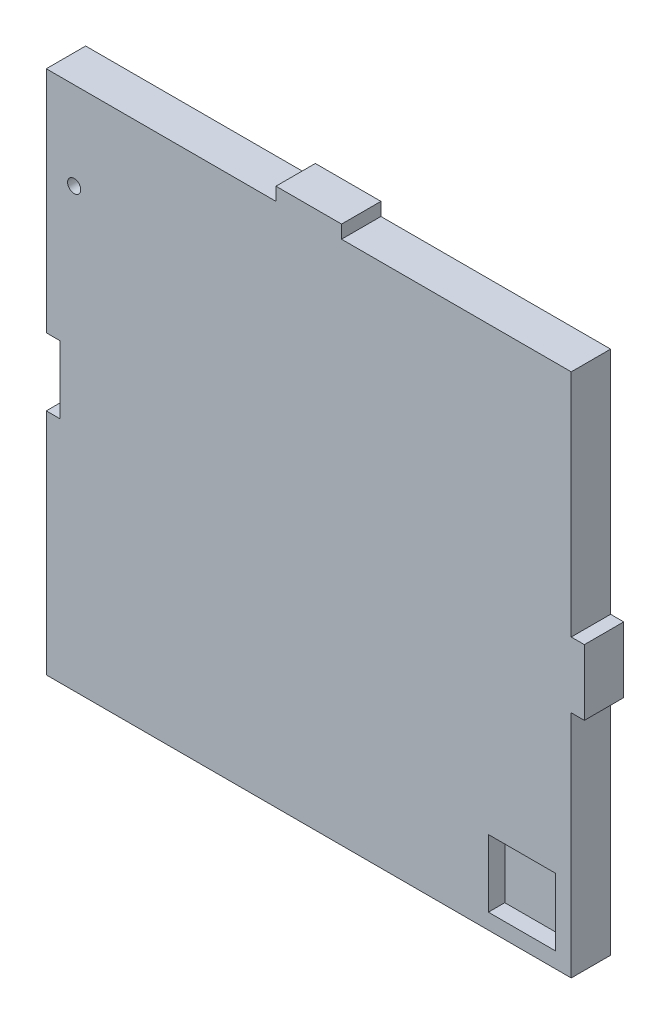
ISO-10303-21;
HEADER;
FILE_DESCRIPTION(('STEP AP214'),'2;1');
FILE_NAME('part.step','',(''),(''),'','','');
FILE_SCHEMA(('AUTOMOTIVE_DESIGN { 1 0 10303 214 1 1 1 1 }'));
ENDSEC;
DATA;
#1=APPLICATION_CONTEXT('core data for automotive mechanical design processes');
#2=APPLICATION_PROTOCOL_DEFINITION('international standard','automotive_design',2000,#1);
#3=PRODUCT_CONTEXT('',#1,'mechanical');
#4=PRODUCT('Part','Part','',(#3));
#5=PRODUCT_RELATED_PRODUCT_CATEGORY('part','',(#4));
#6=PRODUCT_DEFINITION_FORMATION('','',#4);
#7=PRODUCT_DEFINITION_CONTEXT('part definition',#1,'design');
#8=PRODUCT_DEFINITION('design','',#6,#7);
#9=PRODUCT_DEFINITION_SHAPE('','',#8);
#10=(LENGTH_UNIT() NAMED_UNIT(*) SI_UNIT(.MILLI.,.METRE.));
#11=(NAMED_UNIT(*) PLANE_ANGLE_UNIT() SI_UNIT($,.RADIAN.));
#12=(NAMED_UNIT(*) SI_UNIT($,.STERADIAN.) SOLID_ANGLE_UNIT());
#13=UNCERTAINTY_MEASURE_WITH_UNIT(LENGTH_MEASURE(1.E-05),#10,'distance_accuracy_value','');
#14=(GEOMETRIC_REPRESENTATION_CONTEXT(3) GLOBAL_UNCERTAINTY_ASSIGNED_CONTEXT((#13)) GLOBAL_UNIT_ASSIGNED_CONTEXT((#10,
#11,#12)) REPRESENTATION_CONTEXT('',''));
#15=CARTESIAN_POINT('',(0.,0.,0.));
#16=DIRECTION('',(0.,0.,1.));
#17=DIRECTION('',(1.,0.,0.));
#18=AXIS2_PLACEMENT_3D('',#15,#16,#17);
#19=CARTESIAN_POINT('',(8.50000000002549,133.299999999994,12.));
#20=DIRECTION('',(0.,0.,-1.));
#21=DIRECTION('',(-1.,0.,0.));
#22=AXIS2_PLACEMENT_3D('',#19,#20,#21);
#23=CYLINDRICAL_SURFACE('',#22,2.);
#24=CARTESIAN_POINT('',(8.50000000002549,133.299999999994,12.));
#25=DIRECTION('',(0.,0.,1.));
#26=DIRECTION('',(1.,0.,0.));
#27=AXIS2_PLACEMENT_3D('',#24,#25,#26);
#28=CIRCLE('',#27,2.);
#29=CARTESIAN_POINT('',(10.5000000000255,133.299999999994,12.));
#30=VERTEX_POINT('',#29);
#31=EDGE_CURVE('E205',#30,#30,#28,.T.);
#32=ORIENTED_EDGE('',*,*,#31,.T.);
#33=EDGE_LOOP('',(#32));
#34=FACE_BOUND('',#33,.T.);
#35=CARTESIAN_POINT('',(8.50000000002549,133.299999999994,8.));
#36=DIRECTION('',(0.,0.,-1.));
#37=DIRECTION('',(-1.,0.,0.));
#38=AXIS2_PLACEMENT_3D('',#35,#36,#37);
#39=CIRCLE('',#38,2.);
#40=CARTESIAN_POINT('',(6.50000000002548,133.299999999994,8.));
#41=VERTEX_POINT('',#40);
#42=EDGE_CURVE('E43',#41,#41,#39,.T.);
#43=ORIENTED_EDGE('',*,*,#42,.T.);
#44=EDGE_LOOP('',(#43));
#45=FACE_BOUND('',#44,.T.);
#46=ADVANCED_FACE('F39',(#34,#45),#23,.F.);
#47=CARTESIAN_POINT('',(0.,0.,12.));
#48=DIRECTION('',(0.,0.,1.));
#49=DIRECTION('',(1.,0.,0.));
#50=AXIS2_PLACEMENT_3D('',#47,#48,#49);
#51=PLANE('',#50);
#52=DIRECTION('',(0.,-1.,0.));
#53=VECTOR('',#52,1.);
#54=CARTESIAN_POINT('',(134.75,25.25,12.));
#55=LINE('',#54,#53);
#56=CARTESIAN_POINT('',(134.75,25.25,12.));
#57=VERTEX_POINT('',#56);
#58=CARTESIAN_POINT('',(134.75,4.75,12.));
#59=VERTEX_POINT('',#58);
#60=EDGE_CURVE('E54',#57,#59,#55,.T.);
#61=ORIENTED_EDGE('',*,*,#60,.F.);
#62=DIRECTION('',(-1.,0.,0.));
#63=VECTOR('',#62,1.);
#64=CARTESIAN_POINT('',(155.25,25.25,12.));
#65=LINE('',#64,#63);
#66=CARTESIAN_POINT('',(155.25,25.25,12.));
#67=VERTEX_POINT('',#66);
#68=EDGE_CURVE('E333',#67,#57,#65,.T.);
#69=ORIENTED_EDGE('',*,*,#68,.F.);
#70=DIRECTION('',(0.,1.,0.));
#71=VECTOR('',#70,1.);
#72=CARTESIAN_POINT('',(155.25,4.75,12.));
#73=LINE('',#72,#71);
#74=CARTESIAN_POINT('',(155.25,4.75,12.));
#75=VERTEX_POINT('',#74);
#76=EDGE_CURVE('E338',#75,#67,#73,.T.);
#77=ORIENTED_EDGE('',*,*,#76,.F.);
#78=DIRECTION('',(1.,0.,0.));
#79=VECTOR('',#78,1.);
#80=CARTESIAN_POINT('',(134.75,4.75,12.));
#81=LINE('',#80,#79);
#82=EDGE_CURVE('E345',#59,#75,#81,.T.);
#83=ORIENTED_EDGE('',*,*,#82,.F.);
#84=EDGE_LOOP('',(#61,#69,#77,#83));
#85=FACE_BOUND('',#84,.T.);
#86=DIRECTION('',(0.,-1.,0.));
#87=VECTOR('',#86,1.);
#88=CARTESIAN_POINT('',(0.,69.7,12.));
#89=LINE('',#88,#87);
#90=CARTESIAN_POINT('',(0.,69.7,12.));
#91=VERTEX_POINT('',#90);
#92=CARTESIAN_POINT('',(0.,0.,12.));
#93=VERTEX_POINT('',#92);
#94=EDGE_CURVE('E229',#91,#93,#89,.T.);
#95=ORIENTED_EDGE('',*,*,#94,.T.);
#96=DIRECTION('',(1.,0.,0.));
#97=VECTOR('',#96,1.);
#98=CARTESIAN_POINT('',(0.,0.,12.));
#99=LINE('',#98,#97);
#100=CARTESIAN_POINT('',(160.,0.,12.));
#101=VERTEX_POINT('',#100);
#102=EDGE_CURVE('E129',#93,#101,#99,.T.);
#103=ORIENTED_EDGE('',*,*,#102,.T.);
#104=DIRECTION('',(0.,1.,0.));
#105=VECTOR('',#104,1.);
#106=CARTESIAN_POINT('',(160.,0.,12.));
#107=LINE('',#106,#105);
#108=CARTESIAN_POINT('',(160.,70.,12.));
#109=VERTEX_POINT('',#108);
#110=EDGE_CURVE('E269',#101,#109,#107,.T.);
#111=ORIENTED_EDGE('',*,*,#110,.T.);
#112=DIRECTION('',(1.,0.,0.));
#113=VECTOR('',#112,1.);
#114=CARTESIAN_POINT('',(160.,70.,12.));
#115=LINE('',#114,#113);
#116=CARTESIAN_POINT('',(164.,70.,12.));
#117=VERTEX_POINT('',#116);
#118=EDGE_CURVE('E286',#109,#117,#115,.T.);
#119=ORIENTED_EDGE('',*,*,#118,.T.);
#120=DIRECTION('',(0.,1.,0.));
#121=VECTOR('',#120,1.);
#122=CARTESIAN_POINT('',(164.,70.,12.));
#123=LINE('',#122,#121);
#124=CARTESIAN_POINT('',(164.,90.,12.));
#125=VERTEX_POINT('',#124);
#126=EDGE_CURVE('E284',#117,#125,#123,.T.);
#127=ORIENTED_EDGE('',*,*,#126,.T.);
#128=DIRECTION('',(-1.,0.,0.));
#129=VECTOR('',#128,1.);
#130=CARTESIAN_POINT('',(164.,90.,12.));
#131=LINE('',#130,#129);
#132=CARTESIAN_POINT('',(160.,90.,12.));
#133=VERTEX_POINT('',#132);
#134=EDGE_CURVE('E290',#125,#133,#131,.T.);
#135=ORIENTED_EDGE('',*,*,#134,.T.);
#136=DIRECTION('',(0.,1.,0.));
#137=VECTOR('',#136,1.);
#138=CARTESIAN_POINT('',(160.,90.,12.));
#139=LINE('',#138,#137);
#140=CARTESIAN_POINT('',(160.,160.,12.));
#141=VERTEX_POINT('',#140);
#142=EDGE_CURVE('E289',#133,#141,#139,.T.);
#143=ORIENTED_EDGE('',*,*,#142,.T.);
#144=DIRECTION('',(-1.,0.,0.));
#145=VECTOR('',#144,1.);
#146=CARTESIAN_POINT('',(160.,160.,12.));
#147=LINE('',#146,#145);
#148=CARTESIAN_POINT('',(90.,160.,12.));
#149=VERTEX_POINT('',#148);
#150=EDGE_CURVE('E296',#141,#149,#147,.T.);
#151=ORIENTED_EDGE('',*,*,#150,.T.);
#152=DIRECTION('',(0.,1.,0.));
#153=VECTOR('',#152,1.);
#154=CARTESIAN_POINT('',(90.,160.,12.));
#155=LINE('',#154,#153);
#156=CARTESIAN_POINT('',(90.,164.,12.));
#157=VERTEX_POINT('',#156);
#158=EDGE_CURVE('E297',#149,#157,#155,.T.);
#159=ORIENTED_EDGE('',*,*,#158,.T.);
#160=DIRECTION('',(-1.,0.,0.));
#161=VECTOR('',#160,1.);
#162=CARTESIAN_POINT('',(90.,164.,12.));
#163=LINE('',#162,#161);
#164=CARTESIAN_POINT('',(70.,164.,12.));
#165=VERTEX_POINT('',#164);
#166=EDGE_CURVE('E299',#157,#165,#163,.T.);
#167=ORIENTED_EDGE('',*,*,#166,.T.);
#168=DIRECTION('',(0.,-1.,0.));
#169=VECTOR('',#168,1.);
#170=CARTESIAN_POINT('',(70.,164.,12.));
#171=LINE('',#170,#169);
#172=CARTESIAN_POINT('',(70.,160.,12.));
#173=VERTEX_POINT('',#172);
#174=EDGE_CURVE('E305',#165,#173,#171,.T.);
#175=ORIENTED_EDGE('',*,*,#174,.T.);
#176=DIRECTION('',(-1.,0.,0.));
#177=VECTOR('',#176,1.);
#178=CARTESIAN_POINT('',(70.,160.,12.));
#179=LINE('',#178,#177);
#180=CARTESIAN_POINT('',(0.,160.,12.));
#181=VERTEX_POINT('',#180);
#182=EDGE_CURVE('E302',#173,#181,#179,.T.);
#183=ORIENTED_EDGE('',*,*,#182,.T.);
#184=DIRECTION('',(0.,-1.,0.));
#185=VECTOR('',#184,1.);
#186=CARTESIAN_POINT('',(0.,160.,12.));
#187=LINE('',#186,#185);
#188=CARTESIAN_POINT('',(0.,90.3,12.));
#189=VERTEX_POINT('',#188);
#190=EDGE_CURVE('E180',#181,#189,#187,.T.);
#191=ORIENTED_EDGE('',*,*,#190,.T.);
#192=DIRECTION('',(1.,0.,0.));
#193=VECTOR('',#192,1.);
#194=CARTESIAN_POINT('',(0.,90.3,12.));
#195=LINE('',#194,#193);
#196=CARTESIAN_POINT('',(4.2,90.3,12.));
#197=VERTEX_POINT('',#196);
#198=EDGE_CURVE('E166',#189,#197,#195,.T.);
#199=ORIENTED_EDGE('',*,*,#198,.T.);
#200=DIRECTION('',(0.,-1.,0.));
#201=VECTOR('',#200,1.);
#202=CARTESIAN_POINT('',(4.2,90.3,12.));
#203=LINE('',#202,#201);
#204=CARTESIAN_POINT('',(4.2,69.7,12.));
#205=VERTEX_POINT('',#204);
#206=EDGE_CURVE('E173',#197,#205,#203,.T.);
#207=ORIENTED_EDGE('',*,*,#206,.T.);
#208=DIRECTION('',(-1.,0.,0.));
#209=VECTOR('',#208,1.);
#210=CARTESIAN_POINT('',(4.2,69.7,12.));
#211=LINE('',#210,#209);
#212=EDGE_CURVE('E63',#205,#91,#211,.T.);
#213=ORIENTED_EDGE('',*,*,#212,.T.);
#214=EDGE_LOOP('',(#95,#103,#111,#119,#127,#135,#143,#151,#159,#167,#175,#183,#191,#199,#207,#213));
#215=FACE_BOUND('',#214,.T.);
#216=ORIENTED_EDGE('',*,*,#31,.F.);
#217=EDGE_LOOP('',(#216));
#218=FACE_BOUND('',#217,.T.);
#219=ADVANCED_FACE('F171',(#85,#215,#218),#51,.T.);
#220=CARTESIAN_POINT('',(0.,0.,0.));
#221=DIRECTION('',(0.,0.,1.));
#222=DIRECTION('',(1.,0.,0.));
#223=AXIS2_PLACEMENT_3D('',#220,#221,#222);
#224=PLANE('',#223);
#225=CARTESIAN_POINT('',(8.50000000002549,133.299999999994,0.));
#226=DIRECTION('',(0.,0.,-1.));
#227=DIRECTION('',(-1.,0.,0.));
#228=AXIS2_PLACEMENT_3D('',#225,#226,#227);
#229=CIRCLE('',#228,3.45000000000001);
#230=CARTESIAN_POINT('',(5.05000000002548,133.299999999994,0.));
#231=VERTEX_POINT('',#230);
#232=EDGE_CURVE('E358',#231,#231,#229,.T.);
#233=ORIENTED_EDGE('',*,*,#232,.F.);
#234=EDGE_LOOP('',(#233));
#235=FACE_BOUND('',#234,.T.);
#236=DIRECTION('',(0.,-1.,0.));
#237=VECTOR('',#236,1.);
#238=CARTESIAN_POINT('',(0.,69.7,0.));
#239=LINE('',#238,#237);
#240=CARTESIAN_POINT('',(0.,69.7,0.));
#241=VERTEX_POINT('',#240);
#242=CARTESIAN_POINT('',(0.,0.,0.));
#243=VERTEX_POINT('',#242);
#244=EDGE_CURVE('E196',#241,#243,#239,.T.);
#245=ORIENTED_EDGE('',*,*,#244,.F.);
#246=DIRECTION('',(-1.,0.,0.));
#247=VECTOR('',#246,1.);
#248=CARTESIAN_POINT('',(4.2,69.7,0.));
#249=LINE('',#248,#247);
#250=CARTESIAN_POINT('',(4.2,69.7,0.));
#251=VERTEX_POINT('',#250);
#252=EDGE_CURVE('E123',#251,#241,#249,.T.);
#253=ORIENTED_EDGE('',*,*,#252,.F.);
#254=DIRECTION('',(0.,-1.,0.));
#255=VECTOR('',#254,1.);
#256=CARTESIAN_POINT('',(4.2,90.3,0.));
#257=LINE('',#256,#255);
#258=CARTESIAN_POINT('',(4.2,90.3,0.));
#259=VERTEX_POINT('',#258);
#260=EDGE_CURVE('E230',#259,#251,#257,.T.);
#261=ORIENTED_EDGE('',*,*,#260,.F.);
#262=DIRECTION('',(1.,0.,0.));
#263=VECTOR('',#262,1.);
#264=CARTESIAN_POINT('',(0.,90.3,0.));
#265=LINE('',#264,#263);
#266=CARTESIAN_POINT('',(0.,90.3,0.));
#267=VERTEX_POINT('',#266);
#268=EDGE_CURVE('E186',#267,#259,#265,.T.);
#269=ORIENTED_EDGE('',*,*,#268,.F.);
#270=DIRECTION('',(0.,-1.,0.));
#271=VECTOR('',#270,1.);
#272=CARTESIAN_POINT('',(0.,160.,0.));
#273=LINE('',#272,#271);
#274=CARTESIAN_POINT('',(0.,160.,0.));
#275=VERTEX_POINT('',#274);
#276=EDGE_CURVE('E221',#275,#267,#273,.T.);
#277=ORIENTED_EDGE('',*,*,#276,.F.);
#278=DIRECTION('',(-1.,0.,0.));
#279=VECTOR('',#278,1.);
#280=CARTESIAN_POINT('',(70.,160.,0.));
#281=LINE('',#280,#279);
#282=CARTESIAN_POINT('',(70.,160.,0.));
#283=VERTEX_POINT('',#282);
#284=EDGE_CURVE('E225',#283,#275,#281,.T.);
#285=ORIENTED_EDGE('',*,*,#284,.F.);
#286=DIRECTION('',(0.,-1.,0.));
#287=VECTOR('',#286,1.);
#288=CARTESIAN_POINT('',(70.,164.,0.));
#289=LINE('',#288,#287);
#290=CARTESIAN_POINT('',(70.,164.,0.));
#291=VERTEX_POINT('',#290);
#292=EDGE_CURVE('E219',#291,#283,#289,.T.);
#293=ORIENTED_EDGE('',*,*,#292,.F.);
#294=DIRECTION('',(-1.,0.,0.));
#295=VECTOR('',#294,1.);
#296=CARTESIAN_POINT('',(90.,164.,0.));
#297=LINE('',#296,#295);
#298=CARTESIAN_POINT('',(90.,164.,0.));
#299=VERTEX_POINT('',#298);
#300=EDGE_CURVE('E217',#299,#291,#297,.T.);
#301=ORIENTED_EDGE('',*,*,#300,.F.);
#302=DIRECTION('',(0.,1.,0.));
#303=VECTOR('',#302,1.);
#304=CARTESIAN_POINT('',(90.,160.,0.));
#305=LINE('',#304,#303);
#306=CARTESIAN_POINT('',(90.,160.,0.));
#307=VERTEX_POINT('',#306);
#308=EDGE_CURVE('E216',#307,#299,#305,.T.);
#309=ORIENTED_EDGE('',*,*,#308,.F.);
#310=DIRECTION('',(-1.,0.,0.));
#311=VECTOR('',#310,1.);
#312=CARTESIAN_POINT('',(160.,160.,0.));
#313=LINE('',#312,#311);
#314=CARTESIAN_POINT('',(160.,160.,0.));
#315=VERTEX_POINT('',#314);
#316=EDGE_CURVE('E212',#315,#307,#313,.T.);
#317=ORIENTED_EDGE('',*,*,#316,.F.);
#318=DIRECTION('',(0.,1.,0.));
#319=VECTOR('',#318,1.);
#320=CARTESIAN_POINT('',(160.,90.,0.));
#321=LINE('',#320,#319);
#322=CARTESIAN_POINT('',(160.,90.,0.));
#323=VERTEX_POINT('',#322);
#324=EDGE_CURVE('E215',#323,#315,#321,.T.);
#325=ORIENTED_EDGE('',*,*,#324,.F.);
#326=DIRECTION('',(-1.,0.,0.));
#327=VECTOR('',#326,1.);
#328=CARTESIAN_POINT('',(164.,90.,0.));
#329=LINE('',#328,#327);
#330=CARTESIAN_POINT('',(164.,90.,0.));
#331=VERTEX_POINT('',#330);
#332=EDGE_CURVE('E209',#331,#323,#329,.T.);
#333=ORIENTED_EDGE('',*,*,#332,.F.);
#334=DIRECTION('',(0.,1.,0.));
#335=VECTOR('',#334,1.);
#336=CARTESIAN_POINT('',(164.,70.,0.));
#337=LINE('',#336,#335);
#338=CARTESIAN_POINT('',(164.,70.,0.));
#339=VERTEX_POINT('',#338);
#340=EDGE_CURVE('E208',#339,#331,#337,.T.);
#341=ORIENTED_EDGE('',*,*,#340,.F.);
#342=DIRECTION('',(1.,0.,0.));
#343=VECTOR('',#342,1.);
#344=CARTESIAN_POINT('',(160.,70.,0.));
#345=LINE('',#344,#343);
#346=CARTESIAN_POINT('',(160.,70.,0.));
#347=VERTEX_POINT('',#346);
#348=EDGE_CURVE('E206',#347,#339,#345,.T.);
#349=ORIENTED_EDGE('',*,*,#348,.F.);
#350=DIRECTION('',(0.,1.,0.));
#351=VECTOR('',#350,1.);
#352=CARTESIAN_POINT('',(160.,0.,0.));
#353=LINE('',#352,#351);
#354=CARTESIAN_POINT('',(160.,0.,0.));
#355=VERTEX_POINT('',#354);
#356=EDGE_CURVE('E204',#355,#347,#353,.T.);
#357=ORIENTED_EDGE('',*,*,#356,.F.);
#358=DIRECTION('',(1.,0.,0.));
#359=VECTOR('',#358,1.);
#360=CARTESIAN_POINT('',(90.3,0.,0.));
#361=LINE('',#360,#359);
#362=EDGE_CURVE('E203',#243,#355,#361,.T.);
#363=ORIENTED_EDGE('',*,*,#362,.F.);
#364=EDGE_LOOP('',(#245,#253,#261,#269,#277,#285,#293,#301,#309,#317,#325,#333,#341,#349,#357,#363));
#365=FACE_BOUND('',#364,.T.);
#366=ADVANCED_FACE('F273',(#235,#365),#224,.F.);
#367=CARTESIAN_POINT('',(0.,69.7,12.));
#368=DIRECTION('',(1.,0.,0.));
#369=DIRECTION('',(0.,0.,-1.));
#370=AXIS2_PLACEMENT_3D('',#367,#368,#369);
#371=PLANE('',#370);
#372=ORIENTED_EDGE('',*,*,#244,.T.);
#373=DIRECTION('',(0.,0.,-1.));
#374=VECTOR('',#373,1.);
#375=CARTESIAN_POINT('',(0.,0.,12.));
#376=LINE('',#375,#374);
#377=EDGE_CURVE('E11',#93,#243,#376,.T.);
#378=ORIENTED_EDGE('',*,*,#377,.F.);
#379=ORIENTED_EDGE('',*,*,#94,.F.);
#380=DIRECTION('',(0.,0.,-1.));
#381=VECTOR('',#380,1.);
#382=CARTESIAN_POINT('',(0.,69.7,12.));
#383=LINE('',#382,#381);
#384=EDGE_CURVE('E192',#91,#241,#383,.T.);
#385=ORIENTED_EDGE('',*,*,#384,.T.);
#386=EDGE_LOOP('',(#372,#378,#379,#385));
#387=FACE_BOUND('',#386,.T.);
#388=ADVANCED_FACE('F41',(#387),#371,.F.);
#389=CARTESIAN_POINT('',(90.3,0.,12.));
#390=DIRECTION('',(0.,1.,0.));
#391=DIRECTION('',(0.,0.,1.));
#392=AXIS2_PLACEMENT_3D('',#389,#390,#391);
#393=PLANE('',#392);
#394=ORIENTED_EDGE('',*,*,#362,.T.);
#395=DIRECTION('',(0.,0.,-1.));
#396=VECTOR('',#395,1.);
#397=CARTESIAN_POINT('',(160.,0.,12.));
#398=LINE('',#397,#396);
#399=EDGE_CURVE('E48',#101,#355,#398,.T.);
#400=ORIENTED_EDGE('',*,*,#399,.F.);
#401=ORIENTED_EDGE('',*,*,#102,.F.);
#402=ORIENTED_EDGE('',*,*,#377,.T.);
#403=EDGE_LOOP('',(#394,#400,#401,#402));
#404=FACE_BOUND('',#403,.T.);
#405=ADVANCED_FACE('F435',(#404),#393,.F.);
#406=CARTESIAN_POINT('',(160.,0.,12.));
#407=DIRECTION('',(-1.,0.,0.));
#408=DIRECTION('',(0.,0.,1.));
#409=AXIS2_PLACEMENT_3D('',#406,#407,#408);
#410=PLANE('',#409);
#411=ORIENTED_EDGE('',*,*,#356,.T.);
#412=DIRECTION('',(0.,0.,-1.));
#413=VECTOR('',#412,1.);
#414=CARTESIAN_POINT('',(160.,70.,12.));
#415=LINE('',#414,#413);
#416=EDGE_CURVE('E261',#109,#347,#415,.T.);
#417=ORIENTED_EDGE('',*,*,#416,.F.);
#418=ORIENTED_EDGE('',*,*,#110,.F.);
#419=ORIENTED_EDGE('',*,*,#399,.T.);
#420=EDGE_LOOP('',(#411,#417,#418,#419));
#421=FACE_BOUND('',#420,.T.);
#422=ADVANCED_FACE('F268',(#421),#410,.F.);
#423=CARTESIAN_POINT('',(160.,70.,12.));
#424=DIRECTION('',(0.,1.,0.));
#425=DIRECTION('',(0.,0.,1.));
#426=AXIS2_PLACEMENT_3D('',#423,#424,#425);
#427=PLANE('',#426);
#428=ORIENTED_EDGE('',*,*,#348,.T.);
#429=DIRECTION('',(0.,0.,-1.));
#430=VECTOR('',#429,1.);
#431=CARTESIAN_POINT('',(164.,70.,12.));
#432=LINE('',#431,#430);
#433=EDGE_CURVE('E256',#117,#339,#432,.T.);
#434=ORIENTED_EDGE('',*,*,#433,.F.);
#435=ORIENTED_EDGE('',*,*,#118,.F.);
#436=ORIENTED_EDGE('',*,*,#416,.T.);
#437=EDGE_LOOP('',(#428,#434,#435,#436));
#438=FACE_BOUND('',#437,.T.);
#439=ADVANCED_FACE('F276',(#438),#427,.F.);
#440=CARTESIAN_POINT('',(164.,70.,12.));
#441=DIRECTION('',(-1.,0.,0.));
#442=DIRECTION('',(0.,0.,1.));
#443=AXIS2_PLACEMENT_3D('',#440,#441,#442);
#444=PLANE('',#443);
#445=ORIENTED_EDGE('',*,*,#340,.T.);
#446=DIRECTION('',(0.,0.,-1.));
#447=VECTOR('',#446,1.);
#448=CARTESIAN_POINT('',(164.,90.,12.));
#449=LINE('',#448,#447);
#450=EDGE_CURVE('E254',#125,#331,#449,.T.);
#451=ORIENTED_EDGE('',*,*,#450,.F.);
#452=ORIENTED_EDGE('',*,*,#126,.F.);
#453=ORIENTED_EDGE('',*,*,#433,.T.);
#454=EDGE_LOOP('',(#445,#451,#452,#453));
#455=FACE_BOUND('',#454,.T.);
#456=ADVANCED_FACE('F282',(#455),#444,.F.);
#457=CARTESIAN_POINT('',(164.,90.,12.));
#458=DIRECTION('',(0.,-1.,0.));
#459=DIRECTION('',(0.,0.,-1.));
#460=AXIS2_PLACEMENT_3D('',#457,#458,#459);
#461=PLANE('',#460);
#462=ORIENTED_EDGE('',*,*,#332,.T.);
#463=DIRECTION('',(0.,0.,-1.));
#464=VECTOR('',#463,1.);
#465=CARTESIAN_POINT('',(160.,90.,12.));
#466=LINE('',#465,#464);
#467=EDGE_CURVE('E252',#133,#323,#466,.T.);
#468=ORIENTED_EDGE('',*,*,#467,.F.);
#469=ORIENTED_EDGE('',*,*,#134,.F.);
#470=ORIENTED_EDGE('',*,*,#450,.T.);
#471=EDGE_LOOP('',(#462,#468,#469,#470));
#472=FACE_BOUND('',#471,.T.);
#473=ADVANCED_FACE('F425',(#472),#461,.F.);
#474=CARTESIAN_POINT('',(160.,90.,12.));
#475=DIRECTION('',(-1.,0.,0.));
#476=DIRECTION('',(0.,0.,1.));
#477=AXIS2_PLACEMENT_3D('',#474,#475,#476);
#478=PLANE('',#477);
#479=ORIENTED_EDGE('',*,*,#324,.T.);
#480=DIRECTION('',(0.,0.,-1.));
#481=VECTOR('',#480,1.);
#482=CARTESIAN_POINT('',(160.,160.,12.));
#483=LINE('',#482,#481);
#484=EDGE_CURVE('E247',#141,#315,#483,.T.);
#485=ORIENTED_EDGE('',*,*,#484,.F.);
#486=ORIENTED_EDGE('',*,*,#142,.F.);
#487=ORIENTED_EDGE('',*,*,#467,.T.);
#488=EDGE_LOOP('',(#479,#485,#486,#487));
#489=FACE_BOUND('',#488,.T.);
#490=ADVANCED_FACE('F416',(#489),#478,.F.);
#491=CARTESIAN_POINT('',(160.,160.,12.));
#492=DIRECTION('',(0.,-1.,0.));
#493=DIRECTION('',(0.,0.,-1.));
#494=AXIS2_PLACEMENT_3D('',#491,#492,#493);
#495=PLANE('',#494);
#496=ORIENTED_EDGE('',*,*,#316,.T.);
#497=DIRECTION('',(0.,0.,-1.));
#498=VECTOR('',#497,1.);
#499=CARTESIAN_POINT('',(90.,160.,12.));
#500=LINE('',#499,#498);
#501=EDGE_CURVE('E248',#149,#307,#500,.T.);
#502=ORIENTED_EDGE('',*,*,#501,.F.);
#503=ORIENTED_EDGE('',*,*,#150,.F.);
#504=ORIENTED_EDGE('',*,*,#484,.T.);
#505=EDGE_LOOP('',(#496,#502,#503,#504));
#506=FACE_BOUND('',#505,.T.);
#507=ADVANCED_FACE('F412',(#506),#495,.F.);
#508=CARTESIAN_POINT('',(90.,160.,12.));
#509=DIRECTION('',(-1.,0.,0.));
#510=DIRECTION('',(0.,0.,1.));
#511=AXIS2_PLACEMENT_3D('',#508,#509,#510);
#512=PLANE('',#511);
#513=ORIENTED_EDGE('',*,*,#308,.T.);
#514=DIRECTION('',(0.,0.,-1.));
#515=VECTOR('',#514,1.);
#516=CARTESIAN_POINT('',(90.,164.,12.));
#517=LINE('',#516,#515);
#518=EDGE_CURVE('E242',#157,#299,#517,.T.);
#519=ORIENTED_EDGE('',*,*,#518,.F.);
#520=ORIENTED_EDGE('',*,*,#158,.F.);
#521=ORIENTED_EDGE('',*,*,#501,.T.);
#522=EDGE_LOOP('',(#513,#519,#520,#521));
#523=FACE_BOUND('',#522,.T.);
#524=ADVANCED_FACE('F409',(#523),#512,.F.);
#525=CARTESIAN_POINT('',(90.,164.,12.));
#526=DIRECTION('',(0.,-1.,0.));
#527=DIRECTION('',(0.,0.,-1.));
#528=AXIS2_PLACEMENT_3D('',#525,#526,#527);
#529=PLANE('',#528);
#530=ORIENTED_EDGE('',*,*,#300,.T.);
#531=DIRECTION('',(0.,0.,-1.));
#532=VECTOR('',#531,1.);
#533=CARTESIAN_POINT('',(70.,164.,12.));
#534=LINE('',#533,#532);
#535=EDGE_CURVE('E238',#165,#291,#534,.T.);
#536=ORIENTED_EDGE('',*,*,#535,.F.);
#537=ORIENTED_EDGE('',*,*,#166,.F.);
#538=ORIENTED_EDGE('',*,*,#518,.T.);
#539=EDGE_LOOP('',(#530,#536,#537,#538));
#540=FACE_BOUND('',#539,.T.);
#541=ADVANCED_FACE('F406',(#540),#529,.F.);
#542=CARTESIAN_POINT('',(70.,164.,12.));
#543=DIRECTION('',(1.,0.,0.));
#544=DIRECTION('',(0.,0.,-1.));
#545=AXIS2_PLACEMENT_3D('',#542,#543,#544);
#546=PLANE('',#545);
#547=ORIENTED_EDGE('',*,*,#292,.T.);
#548=DIRECTION('',(0.,0.,-1.));
#549=VECTOR('',#548,1.);
#550=CARTESIAN_POINT('',(70.,160.,12.));
#551=LINE('',#550,#549);
#552=EDGE_CURVE('E240',#173,#283,#551,.T.);
#553=ORIENTED_EDGE('',*,*,#552,.F.);
#554=ORIENTED_EDGE('',*,*,#174,.F.);
#555=ORIENTED_EDGE('',*,*,#535,.T.);
#556=EDGE_LOOP('',(#547,#553,#554,#555));
#557=FACE_BOUND('',#556,.T.);
#558=ADVANCED_FACE('F401',(#557),#546,.F.);
#559=CARTESIAN_POINT('',(70.,160.,12.));
#560=DIRECTION('',(0.,-1.,0.));
#561=DIRECTION('',(0.,0.,-1.));
#562=AXIS2_PLACEMENT_3D('',#559,#560,#561);
#563=PLANE('',#562);
#564=ORIENTED_EDGE('',*,*,#284,.T.);
#565=DIRECTION('',(0.,0.,-1.));
#566=VECTOR('',#565,1.);
#567=CARTESIAN_POINT('',(0.,160.,12.));
#568=LINE('',#567,#566);
#569=EDGE_CURVE('E232',#181,#275,#568,.T.);
#570=ORIENTED_EDGE('',*,*,#569,.F.);
#571=ORIENTED_EDGE('',*,*,#182,.F.);
#572=ORIENTED_EDGE('',*,*,#552,.T.);
#573=EDGE_LOOP('',(#564,#570,#571,#572));
#574=FACE_BOUND('',#573,.T.);
#575=ADVANCED_FACE('F309',(#574),#563,.F.);
#576=CARTESIAN_POINT('',(0.,160.,12.));
#577=DIRECTION('',(1.,0.,0.));
#578=DIRECTION('',(0.,0.,-1.));
#579=AXIS2_PLACEMENT_3D('',#576,#577,#578);
#580=PLANE('',#579);
#581=ORIENTED_EDGE('',*,*,#276,.T.);
#582=DIRECTION('',(0.,0.,-1.));
#583=VECTOR('',#582,1.);
#584=CARTESIAN_POINT('',(0.,90.3,12.));
#585=LINE('',#584,#583);
#586=EDGE_CURVE('E188',#189,#267,#585,.T.);
#587=ORIENTED_EDGE('',*,*,#586,.F.);
#588=ORIENTED_EDGE('',*,*,#190,.F.);
#589=ORIENTED_EDGE('',*,*,#569,.T.);
#590=EDGE_LOOP('',(#581,#587,#588,#589));
#591=FACE_BOUND('',#590,.T.);
#592=ADVANCED_FACE('F314',(#591),#580,.F.);
#593=CARTESIAN_POINT('',(0.,90.3,12.));
#594=DIRECTION('',(0.,1.,0.));
#595=DIRECTION('',(0.,0.,1.));
#596=AXIS2_PLACEMENT_3D('',#593,#594,#595);
#597=PLANE('',#596);
#598=ORIENTED_EDGE('',*,*,#268,.T.);
#599=DIRECTION('',(0.,0.,-1.));
#600=VECTOR('',#599,1.);
#601=CARTESIAN_POINT('',(4.2,90.3,12.));
#602=LINE('',#601,#600);
#603=EDGE_CURVE('E181',#197,#259,#602,.T.);
#604=ORIENTED_EDGE('',*,*,#603,.F.);
#605=ORIENTED_EDGE('',*,*,#198,.F.);
#606=ORIENTED_EDGE('',*,*,#586,.T.);
#607=EDGE_LOOP('',(#598,#604,#605,#606));
#608=FACE_BOUND('',#607,.T.);
#609=ADVANCED_FACE('F184',(#608),#597,.F.);
#610=CARTESIAN_POINT('',(4.2,90.3,12.));
#611=DIRECTION('',(1.,0.,0.));
#612=DIRECTION('',(0.,0.,-1.));
#613=AXIS2_PLACEMENT_3D('',#610,#611,#612);
#614=PLANE('',#613);
#615=ORIENTED_EDGE('',*,*,#260,.T.);
#616=DIRECTION('',(0.,0.,-1.));
#617=VECTOR('',#616,1.);
#618=CARTESIAN_POINT('',(4.2,69.7,12.));
#619=LINE('',#618,#617);
#620=EDGE_CURVE('E189',#205,#251,#619,.T.);
#621=ORIENTED_EDGE('',*,*,#620,.F.);
#622=ORIENTED_EDGE('',*,*,#206,.F.);
#623=ORIENTED_EDGE('',*,*,#603,.T.);
#624=EDGE_LOOP('',(#615,#621,#622,#623));
#625=FACE_BOUND('',#624,.T.);
#626=ADVANCED_FACE('F195',(#625),#614,.F.);
#627=CARTESIAN_POINT('',(4.2,69.7,12.));
#628=DIRECTION('',(0.,-1.,0.));
#629=DIRECTION('',(0.,0.,-1.));
#630=AXIS2_PLACEMENT_3D('',#627,#628,#629);
#631=PLANE('',#630);
#632=ORIENTED_EDGE('',*,*,#252,.T.);
#633=ORIENTED_EDGE('',*,*,#384,.F.);
#634=ORIENTED_EDGE('',*,*,#212,.F.);
#635=ORIENTED_EDGE('',*,*,#620,.T.);
#636=EDGE_LOOP('',(#632,#633,#634,#635));
#637=FACE_BOUND('',#636,.T.);
#638=ADVANCED_FACE('F312',(#637),#631,.F.);
#639=CARTESIAN_POINT('',(134.75,25.25,7.));
#640=DIRECTION('',(-1.,0.,0.));
#641=DIRECTION('',(0.,0.,1.));
#642=AXIS2_PLACEMENT_3D('',#639,#640,#641);
#643=PLANE('',#642);
#644=ORIENTED_EDGE('',*,*,#60,.T.);
#645=DIRECTION('',(0.,0.,1.));
#646=VECTOR('',#645,1.);
#647=CARTESIAN_POINT('',(134.75,4.75,7.));
#648=LINE('',#647,#646);
#649=CARTESIAN_POINT('',(134.75,4.75,7.));
#650=VERTEX_POINT('',#649);
#651=EDGE_CURVE('E324',#650,#59,#648,.T.);
#652=ORIENTED_EDGE('',*,*,#651,.F.);
#653=DIRECTION('',(0.,-1.,0.));
#654=VECTOR('',#653,1.);
#655=CARTESIAN_POINT('',(134.75,25.25,7.));
#656=LINE('',#655,#654);
#657=CARTESIAN_POINT('',(134.75,25.25,7.));
#658=VERTEX_POINT('',#657);
#659=EDGE_CURVE('E337',#658,#650,#656,.T.);
#660=ORIENTED_EDGE('',*,*,#659,.F.);
#661=DIRECTION('',(0.,0.,1.));
#662=VECTOR('',#661,1.);
#663=CARTESIAN_POINT('',(134.75,25.25,7.));
#664=LINE('',#663,#662);
#665=EDGE_CURVE('E322',#658,#57,#664,.T.);
#666=ORIENTED_EDGE('',*,*,#665,.T.);
#667=EDGE_LOOP('',(#644,#652,#660,#666));
#668=FACE_BOUND('',#667,.T.);
#669=ADVANCED_FACE('F389',(#668),#643,.F.);
#670=CARTESIAN_POINT('',(155.25,25.25,7.));
#671=DIRECTION('',(0.,1.,0.));
#672=DIRECTION('',(0.,0.,1.));
#673=AXIS2_PLACEMENT_3D('',#670,#671,#672);
#674=PLANE('',#673);
#675=ORIENTED_EDGE('',*,*,#68,.T.);
#676=ORIENTED_EDGE('',*,*,#665,.F.);
#677=DIRECTION('',(-1.,0.,0.));
#678=VECTOR('',#677,1.);
#679=CARTESIAN_POINT('',(155.25,25.25,7.));
#680=LINE('',#679,#678);
#681=CARTESIAN_POINT('',(155.25,25.25,7.));
#682=VERTEX_POINT('',#681);
#683=EDGE_CURVE('E327',#682,#658,#680,.T.);
#684=ORIENTED_EDGE('',*,*,#683,.F.);
#685=DIRECTION('',(0.,0.,1.));
#686=VECTOR('',#685,1.);
#687=CARTESIAN_POINT('',(155.25,25.25,7.));
#688=LINE('',#687,#686);
#689=EDGE_CURVE('E332',#682,#67,#688,.T.);
#690=ORIENTED_EDGE('',*,*,#689,.T.);
#691=EDGE_LOOP('',(#675,#676,#684,#690));
#692=FACE_BOUND('',#691,.T.);
#693=ADVANCED_FACE('F547',(#692),#674,.F.);
#694=CARTESIAN_POINT('',(155.25,4.75,7.));
#695=DIRECTION('',(1.,0.,0.));
#696=DIRECTION('',(0.,0.,-1.));
#697=AXIS2_PLACEMENT_3D('',#694,#695,#696);
#698=PLANE('',#697);
#699=ORIENTED_EDGE('',*,*,#76,.T.);
#700=ORIENTED_EDGE('',*,*,#689,.F.);
#701=DIRECTION('',(0.,1.,0.));
#702=VECTOR('',#701,1.);
#703=CARTESIAN_POINT('',(155.25,4.75,7.));
#704=LINE('',#703,#702);
#705=CARTESIAN_POINT('',(155.25,4.75,7.));
#706=VERTEX_POINT('',#705);
#707=EDGE_CURVE('E346',#706,#682,#704,.T.);
#708=ORIENTED_EDGE('',*,*,#707,.F.);
#709=DIRECTION('',(0.,0.,1.));
#710=VECTOR('',#709,1.);
#711=CARTESIAN_POINT('',(155.25,4.75,7.));
#712=LINE('',#711,#710);
#713=EDGE_CURVE('E330',#706,#75,#712,.T.);
#714=ORIENTED_EDGE('',*,*,#713,.T.);
#715=EDGE_LOOP('',(#699,#700,#708,#714));
#716=FACE_BOUND('',#715,.T.);
#717=ADVANCED_FACE('F556',(#716),#698,.F.);
#718=CARTESIAN_POINT('',(134.75,4.75,7.));
#719=DIRECTION('',(0.,-1.,0.));
#720=DIRECTION('',(0.,0.,-1.));
#721=AXIS2_PLACEMENT_3D('',#718,#719,#720);
#722=PLANE('',#721);
#723=ORIENTED_EDGE('',*,*,#82,.T.);
#724=ORIENTED_EDGE('',*,*,#713,.F.);
#725=DIRECTION('',(1.,0.,0.));
#726=VECTOR('',#725,1.);
#727=CARTESIAN_POINT('',(134.75,4.75,7.));
#728=LINE('',#727,#726);
#729=EDGE_CURVE('E351',#650,#706,#728,.T.);
#730=ORIENTED_EDGE('',*,*,#729,.F.);
#731=ORIENTED_EDGE('',*,*,#651,.T.);
#732=EDGE_LOOP('',(#723,#724,#730,#731));
#733=FACE_BOUND('',#732,.T.);
#734=ADVANCED_FACE('F567',(#733),#722,.F.);
#735=CARTESIAN_POINT('',(0.,0.,7.));
#736=DIRECTION('',(0.,0.,1.));
#737=DIRECTION('',(1.,0.,0.));
#738=AXIS2_PLACEMENT_3D('',#735,#736,#737);
#739=PLANE('',#738);
#740=ORIENTED_EDGE('',*,*,#659,.T.);
#741=ORIENTED_EDGE('',*,*,#729,.T.);
#742=ORIENTED_EDGE('',*,*,#707,.T.);
#743=ORIENTED_EDGE('',*,*,#683,.T.);
#744=EDGE_LOOP('',(#740,#741,#742,#743));
#745=FACE_BOUND('',#744,.T.);
#746=ADVANCED_FACE('F372',(#745),#739,.T.);
#747=CARTESIAN_POINT('',(8.50000000002549,133.299999999994,8.));
#748=DIRECTION('',(0.,0.,-1.));
#749=DIRECTION('',(-1.,0.,0.));
#750=AXIS2_PLACEMENT_3D('',#747,#748,#749);
#751=CYLINDRICAL_SURFACE('',#750,3.45000000000001);
#752=CARTESIAN_POINT('',(8.50000000002549,133.299999999994,8.));
#753=DIRECTION('',(0.,0.,-1.));
#754=DIRECTION('',(-1.,0.,0.));
#755=AXIS2_PLACEMENT_3D('',#752,#753,#754);
#756=CIRCLE('',#755,3.45000000000001);
#757=CARTESIAN_POINT('',(5.05000000002548,133.299999999994,8.));
#758=VERTEX_POINT('',#757);
#759=EDGE_CURVE('E357',#758,#758,#756,.T.);
#760=ORIENTED_EDGE('',*,*,#759,.F.);
#761=EDGE_LOOP('',(#760));
#762=FACE_BOUND('',#761,.T.);
#763=ORIENTED_EDGE('',*,*,#232,.T.);
#764=EDGE_LOOP('',(#763));
#765=FACE_BOUND('',#764,.T.);
#766=ADVANCED_FACE('F369',(#762,#765),#751,.F.);
#767=CARTESIAN_POINT('',(8.50000000002549,133.299999999994,8.));
#768=DIRECTION('',(0.,0.,-1.));
#769=DIRECTION('',(-1.,0.,0.));
#770=AXIS2_PLACEMENT_3D('',#767,#768,#769);
#771=PLANE('',#770);
#772=ORIENTED_EDGE('',*,*,#42,.F.);
#773=EDGE_LOOP('',(#772));
#774=FACE_BOUND('',#773,.T.);
#775=ORIENTED_EDGE('',*,*,#759,.T.);
#776=EDGE_LOOP('',(#775));
#777=FACE_BOUND('',#776,.T.);
#778=ADVANCED_FACE('F370',(#774,#777),#771,.T.);
#779=CLOSED_SHELL('',(#46,#219,#366,#388,#405,#422,#439,#456,#473,#490,#507,#524,#541,#558,#575,
#592,#609,#626,#638,#669,#693,#717,#734,#746,#766,#778));
#780=MANIFOLD_SOLID_BREP('B2',#779);
#781=ADVANCED_BREP_SHAPE_REPRESENTATION('',(#18,#780),#14);
#782=SHAPE_DEFINITION_REPRESENTATION(#9,#781);
ENDSEC;
END-ISO-10303-21;
